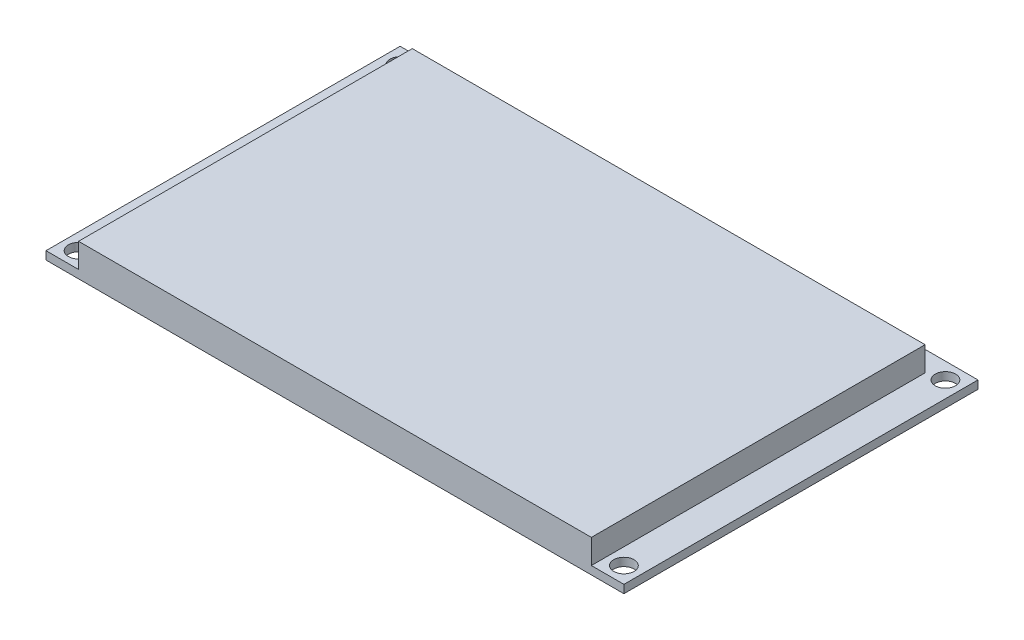
ISO-10303-21;
HEADER;
FILE_DESCRIPTION(('STEP AP214'),'2;1');
FILE_NAME('part.step','',(''),(''),'','','');
FILE_SCHEMA(('AUTOMOTIVE_DESIGN { 1 0 10303 214 1 1 1 1 }'));
ENDSEC;
DATA;
#1=APPLICATION_CONTEXT('core data for automotive mechanical design processes');
#2=APPLICATION_PROTOCOL_DEFINITION('international standard','automotive_design',2000,#1);
#3=PRODUCT_CONTEXT('',#1,'mechanical');
#4=PRODUCT('Part','Part','',(#3));
#5=PRODUCT_RELATED_PRODUCT_CATEGORY('part','',(#4));
#6=PRODUCT_DEFINITION_FORMATION('','',#4);
#7=PRODUCT_DEFINITION_CONTEXT('part definition',#1,'design');
#8=PRODUCT_DEFINITION('design','',#6,#7);
#9=PRODUCT_DEFINITION_SHAPE('','',#8);
#10=(LENGTH_UNIT() NAMED_UNIT(*) SI_UNIT(.MILLI.,.METRE.));
#11=(NAMED_UNIT(*) PLANE_ANGLE_UNIT() SI_UNIT($,.RADIAN.));
#12=(NAMED_UNIT(*) SI_UNIT($,.STERADIAN.) SOLID_ANGLE_UNIT());
#13=UNCERTAINTY_MEASURE_WITH_UNIT(LENGTH_MEASURE(1.E-05),#10,'distance_accuracy_value','');
#14=(GEOMETRIC_REPRESENTATION_CONTEXT(3) GLOBAL_UNCERTAINTY_ASSIGNED_CONTEXT((#13)) GLOBAL_UNIT_ASSIGNED_CONTEXT((#10,
#11,#12)) REPRESENTATION_CONTEXT('',''));
#15=CARTESIAN_POINT('',(0.,0.,0.));
#16=DIRECTION('',(0.,0.,1.));
#17=DIRECTION('',(1.,0.,0.));
#18=AXIS2_PLACEMENT_3D('',#15,#16,#17);
#19=CARTESIAN_POINT('',(35.5,1.,-21.75));
#20=DIRECTION('',(-1.,0.,0.));
#21=DIRECTION('',(0.,0.,1.));
#22=AXIS2_PLACEMENT_3D('',#19,#20,#21);
#23=PLANE('',#22);
#24=DIRECTION('',(0.,0.,-1.));
#25=VECTOR('',#24,1.);
#26=CARTESIAN_POINT('',(35.5,0.,-21.75));
#27=LINE('',#26,#25);
#28=CARTESIAN_POINT('',(35.5,0.,21.75));
#29=VERTEX_POINT('',#28);
#30=CARTESIAN_POINT('',(35.5,0.,-21.75));
#31=VERTEX_POINT('',#30);
#32=EDGE_CURVE('E146',#29,#31,#27,.T.);
#33=ORIENTED_EDGE('',*,*,#32,.T.);
#34=DIRECTION('',(0.,-1.,0.));
#35=VECTOR('',#34,1.);
#36=CARTESIAN_POINT('',(35.5,1.,-21.75));
#37=LINE('',#36,#35);
#38=CARTESIAN_POINT('',(35.5,1.,-21.75));
#39=VERTEX_POINT('',#38);
#40=EDGE_CURVE('E11',#39,#31,#37,.T.);
#41=ORIENTED_EDGE('',*,*,#40,.F.);
#42=DIRECTION('',(0.,0.,-1.));
#43=VECTOR('',#42,1.);
#44=CARTESIAN_POINT('',(35.5,1.,-21.75));
#45=LINE('',#44,#43);
#46=CARTESIAN_POINT('',(35.5,1.,21.75));
#47=VERTEX_POINT('',#46);
#48=EDGE_CURVE('E147',#47,#39,#45,.T.);
#49=ORIENTED_EDGE('',*,*,#48,.F.);
#50=DIRECTION('',(0.,-1.,0.));
#51=VECTOR('',#50,1.);
#52=CARTESIAN_POINT('',(35.5,1.,21.75));
#53=LINE('',#52,#51);
#54=EDGE_CURVE('E158',#47,#29,#53,.T.);
#55=ORIENTED_EDGE('',*,*,#54,.T.);
#56=EDGE_LOOP('',(#33,#41,#49,#55));
#57=FACE_BOUND('',#56,.T.);
#58=ADVANCED_FACE('F33',(#57),#23,.F.);
#59=CARTESIAN_POINT('',(-35.5,1.,-21.75));
#60=DIRECTION('',(0.,0.,1.));
#61=DIRECTION('',(1.,0.,0.));
#62=AXIS2_PLACEMENT_3D('',#59,#60,#61);
#63=PLANE('',#62);
#64=DIRECTION('',(-1.,0.,0.));
#65=VECTOR('',#64,1.);
#66=CARTESIAN_POINT('',(-35.5,0.,-21.75));
#67=LINE('',#66,#65);
#68=CARTESIAN_POINT('',(-35.5,0.,-21.75));
#69=VERTEX_POINT('',#68);
#70=EDGE_CURVE('E161',#31,#69,#67,.T.);
#71=ORIENTED_EDGE('',*,*,#70,.T.);
#72=DIRECTION('',(0.,-1.,0.));
#73=VECTOR('',#72,1.);
#74=CARTESIAN_POINT('',(-35.5,1.,-21.75));
#75=LINE('',#74,#73);
#76=CARTESIAN_POINT('',(-35.5,1.,-21.75));
#77=VERTEX_POINT('',#76);
#78=EDGE_CURVE('E40',#77,#69,#75,.T.);
#79=ORIENTED_EDGE('',*,*,#78,.F.);
#80=DIRECTION('',(-1.,0.,0.));
#81=VECTOR('',#80,1.);
#82=CARTESIAN_POINT('',(-35.5,1.,-21.75));
#83=LINE('',#82,#81);
#84=EDGE_CURVE('E150',#39,#77,#83,.T.);
#85=ORIENTED_EDGE('',*,*,#84,.F.);
#86=ORIENTED_EDGE('',*,*,#40,.T.);
#87=EDGE_LOOP('',(#71,#79,#85,#86));
#88=FACE_BOUND('',#87,.T.);
#89=ADVANCED_FACE('F212',(#88),#63,.F.);
#90=CARTESIAN_POINT('',(-35.5,1.,-21.75));
#91=DIRECTION('',(1.,0.,0.));
#92=DIRECTION('',(0.,0.,-1.));
#93=AXIS2_PLACEMENT_3D('',#90,#91,#92);
#94=PLANE('',#93);
#95=DIRECTION('',(0.,0.,1.));
#96=VECTOR('',#95,1.);
#97=CARTESIAN_POINT('',(-35.5,0.,-21.75));
#98=LINE('',#97,#96);
#99=CARTESIAN_POINT('',(-35.5,0.,21.75));
#100=VERTEX_POINT('',#99);
#101=EDGE_CURVE('E163',#69,#100,#98,.T.);
#102=ORIENTED_EDGE('',*,*,#101,.T.);
#103=DIRECTION('',(0.,-1.,0.));
#104=VECTOR('',#103,1.);
#105=CARTESIAN_POINT('',(-35.5,1.,21.75));
#106=LINE('',#105,#104);
#107=CARTESIAN_POINT('',(-35.5,1.,21.75));
#108=VERTEX_POINT('',#107);
#109=EDGE_CURVE('E168',#108,#100,#106,.T.);
#110=ORIENTED_EDGE('',*,*,#109,.F.);
#111=DIRECTION('',(0.,0.,1.));
#112=VECTOR('',#111,1.);
#113=CARTESIAN_POINT('',(-35.5,1.,-21.75));
#114=LINE('',#113,#112);
#115=EDGE_CURVE('E153',#77,#108,#114,.T.);
#116=ORIENTED_EDGE('',*,*,#115,.F.);
#117=ORIENTED_EDGE('',*,*,#78,.T.);
#118=EDGE_LOOP('',(#102,#110,#116,#117));
#119=FACE_BOUND('',#118,.T.);
#120=ADVANCED_FACE('F175',(#119),#94,.F.);
#121=CARTESIAN_POINT('',(-35.5,1.,21.75));
#122=DIRECTION('',(0.,0.,-1.));
#123=DIRECTION('',(-1.,0.,0.));
#124=AXIS2_PLACEMENT_3D('',#121,#122,#123);
#125=PLANE('',#124);
#126=DIRECTION('',(1.,0.,0.));
#127=VECTOR('',#126,1.);
#128=CARTESIAN_POINT('',(-35.5,0.,21.75));
#129=LINE('',#128,#127);
#130=EDGE_CURVE('E151',#100,#29,#129,.T.);
#131=ORIENTED_EDGE('',*,*,#130,.T.);
#132=ORIENTED_EDGE('',*,*,#54,.F.);
#133=DIRECTION('',(1.,0.,0.));
#134=VECTOR('',#133,1.);
#135=CARTESIAN_POINT('',(-35.5,1.,21.75));
#136=LINE('',#135,#134);
#137=CARTESIAN_POINT('',(31.5,1.,21.75));
#138=VERTEX_POINT('',#137);
#139=EDGE_CURVE('E155',#138,#47,#136,.T.);
#140=ORIENTED_EDGE('',*,*,#139,.F.);
#141=DIRECTION('',(0.,-1.,0.));
#142=VECTOR('',#141,1.);
#143=CARTESIAN_POINT('',(31.5,4.,21.75));
#144=LINE('',#143,#142);
#145=CARTESIAN_POINT('',(31.5,4.,21.75));
#146=VERTEX_POINT('',#145);
#147=EDGE_CURVE('E191',#146,#138,#144,.T.);
#148=ORIENTED_EDGE('',*,*,#147,.F.);
#149=DIRECTION('',(1.,0.,0.));
#150=VECTOR('',#149,1.);
#151=CARTESIAN_POINT('',(-31.5,4.,21.75));
#152=LINE('',#151,#150);
#153=CARTESIAN_POINT('',(-31.5,4.,21.75));
#154=VERTEX_POINT('',#153);
#155=EDGE_CURVE('E110',#154,#146,#152,.T.);
#156=ORIENTED_EDGE('',*,*,#155,.F.);
#157=DIRECTION('',(0.,-1.,0.));
#158=VECTOR('',#157,1.);
#159=CARTESIAN_POINT('',(-31.5,4.,21.75));
#160=LINE('',#159,#158);
#161=CARTESIAN_POINT('',(-31.5,1.,21.75));
#162=VERTEX_POINT('',#161);
#163=EDGE_CURVE('E122',#154,#162,#160,.T.);
#164=ORIENTED_EDGE('',*,*,#163,.T.);
#165=EDGE_CURVE('E156',#108,#162,#136,.T.);
#166=ORIENTED_EDGE('',*,*,#165,.F.);
#167=ORIENTED_EDGE('',*,*,#109,.T.);
#168=EDGE_LOOP('',(#131,#132,#140,#148,#156,#164,#166,#167));
#169=FACE_BOUND('',#168,.T.);
#170=ADVANCED_FACE('F184',(#169),#125,.F.);
#171=CARTESIAN_POINT('',(0.,1.,0.));
#172=DIRECTION('',(0.,1.,0.));
#173=DIRECTION('',(0.,0.,1.));
#174=AXIS2_PLACEMENT_3D('',#171,#172,#173);
#175=PLANE('',#174);
#176=DIRECTION('',(0.,0.,-1.));
#177=VECTOR('',#176,1.);
#178=CARTESIAN_POINT('',(31.5,1.,-19.25));
#179=LINE('',#178,#177);
#180=CARTESIAN_POINT('',(31.5,1.,-19.25));
#181=VERTEX_POINT('',#180);
#182=EDGE_CURVE('E52',#138,#181,#179,.T.);
#183=ORIENTED_EDGE('',*,*,#182,.F.);
#184=ORIENTED_EDGE('',*,*,#139,.T.);
#185=ORIENTED_EDGE('',*,*,#48,.T.);
#186=ORIENTED_EDGE('',*,*,#84,.T.);
#187=ORIENTED_EDGE('',*,*,#115,.T.);
#188=ORIENTED_EDGE('',*,*,#165,.T.);
#189=DIRECTION('',(0.,0.,1.));
#190=VECTOR('',#189,1.);
#191=CARTESIAN_POINT('',(-31.5,1.,-19.25));
#192=LINE('',#191,#190);
#193=CARTESIAN_POINT('',(-31.5,1.,-19.25));
#194=VERTEX_POINT('',#193);
#195=EDGE_CURVE('E114',#194,#162,#192,.T.);
#196=ORIENTED_EDGE('',*,*,#195,.F.);
#197=DIRECTION('',(-1.,0.,0.));
#198=VECTOR('',#197,1.);
#199=CARTESIAN_POINT('',(-31.5,1.,-19.25));
#200=LINE('',#199,#198);
#201=EDGE_CURVE('E47',#181,#194,#200,.T.);
#202=ORIENTED_EDGE('',*,*,#201,.F.);
#203=EDGE_LOOP('',(#183,#184,#185,#186,#187,#188,#196,#202));
#204=FACE_BOUND('',#203,.T.);
#205=CARTESIAN_POINT('',(-33.5,1.,19.75));
#206=DIRECTION('',(0.,1.,0.));
#207=DIRECTION('',(0.,0.,1.));
#208=AXIS2_PLACEMENT_3D('',#205,#206,#207);
#209=CIRCLE('',#208,1.25);
#210=CARTESIAN_POINT('',(-33.5,1.,21.));
#211=VERTEX_POINT('',#210);
#212=EDGE_CURVE('E132',#211,#211,#209,.T.);
#213=ORIENTED_EDGE('',*,*,#212,.F.);
#214=EDGE_LOOP('',(#213));
#215=FACE_BOUND('',#214,.T.);
#216=CARTESIAN_POINT('',(33.5,1.,-19.75));
#217=DIRECTION('',(0.,1.,0.));
#218=DIRECTION('',(0.,0.,1.));
#219=AXIS2_PLACEMENT_3D('',#216,#217,#218);
#220=CIRCLE('',#219,1.25);
#221=CARTESIAN_POINT('',(33.5,1.,-18.5));
#222=VERTEX_POINT('',#221);
#223=EDGE_CURVE('E133',#222,#222,#220,.T.);
#224=ORIENTED_EDGE('',*,*,#223,.F.);
#225=EDGE_LOOP('',(#224));
#226=FACE_BOUND('',#225,.T.);
#227=CARTESIAN_POINT('',(33.5,1.,19.75));
#228=DIRECTION('',(0.,1.,0.));
#229=DIRECTION('',(0.,0.,1.));
#230=AXIS2_PLACEMENT_3D('',#227,#228,#229);
#231=CIRCLE('',#230,1.25);
#232=CARTESIAN_POINT('',(33.5,1.,21.));
#233=VERTEX_POINT('',#232);
#234=EDGE_CURVE('E120',#233,#233,#231,.T.);
#235=ORIENTED_EDGE('',*,*,#234,.F.);
#236=EDGE_LOOP('',(#235));
#237=FACE_BOUND('',#236,.T.);
#238=CARTESIAN_POINT('',(-33.5,1.,-19.75));
#239=DIRECTION('',(0.,1.,0.));
#240=DIRECTION('',(0.,0.,1.));
#241=AXIS2_PLACEMENT_3D('',#238,#239,#240);
#242=CIRCLE('',#241,1.25);
#243=CARTESIAN_POINT('',(-33.5,1.,-18.5));
#244=VERTEX_POINT('',#243);
#245=EDGE_CURVE('E136',#244,#244,#242,.T.);
#246=ORIENTED_EDGE('',*,*,#245,.F.);
#247=EDGE_LOOP('',(#246));
#248=FACE_BOUND('',#247,.T.);
#249=ADVANCED_FACE('F189',(#204,#215,#226,#237,#248),#175,.T.);
#250=CARTESIAN_POINT('',(0.,0.,0.));
#251=DIRECTION('',(0.,1.,0.));
#252=DIRECTION('',(0.,0.,1.));
#253=AXIS2_PLACEMENT_3D('',#250,#251,#252);
#254=PLANE('',#253);
#255=CARTESIAN_POINT('',(-33.5,0.,19.75));
#256=DIRECTION('',(0.,1.,0.));
#257=DIRECTION('',(0.,0.,1.));
#258=AXIS2_PLACEMENT_3D('',#255,#256,#257);
#259=CIRCLE('',#258,1.25);
#260=CARTESIAN_POINT('',(-33.5,0.,21.));
#261=VERTEX_POINT('',#260);
#262=EDGE_CURVE('E129',#261,#261,#259,.F.);
#263=ORIENTED_EDGE('',*,*,#262,.F.);
#264=EDGE_LOOP('',(#263));
#265=FACE_BOUND('',#264,.T.);
#266=CARTESIAN_POINT('',(33.5,0.,-19.75));
#267=DIRECTION('',(0.,1.,0.));
#268=DIRECTION('',(0.,0.,1.));
#269=AXIS2_PLACEMENT_3D('',#266,#267,#268);
#270=CIRCLE('',#269,1.25);
#271=CARTESIAN_POINT('',(33.5,0.,-18.5));
#272=VERTEX_POINT('',#271);
#273=EDGE_CURVE('E128',#272,#272,#270,.F.);
#274=ORIENTED_EDGE('',*,*,#273,.F.);
#275=EDGE_LOOP('',(#274));
#276=FACE_BOUND('',#275,.T.);
#277=CARTESIAN_POINT('',(33.5,0.,19.75));
#278=DIRECTION('',(0.,1.,0.));
#279=DIRECTION('',(0.,0.,1.));
#280=AXIS2_PLACEMENT_3D('',#277,#278,#279);
#281=CIRCLE('',#280,1.25);
#282=CARTESIAN_POINT('',(33.5,0.,21.));
#283=VERTEX_POINT('',#282);
#284=EDGE_CURVE('E117',#283,#283,#281,.F.);
#285=ORIENTED_EDGE('',*,*,#284,.F.);
#286=EDGE_LOOP('',(#285));
#287=FACE_BOUND('',#286,.T.);
#288=CARTESIAN_POINT('',(-33.5,0.,-19.75));
#289=DIRECTION('',(0.,1.,0.));
#290=DIRECTION('',(0.,0.,1.));
#291=AXIS2_PLACEMENT_3D('',#288,#289,#290);
#292=CIRCLE('',#291,1.25);
#293=CARTESIAN_POINT('',(-33.5,0.,-18.5));
#294=VERTEX_POINT('',#293);
#295=EDGE_CURVE('E143',#294,#294,#292,.F.);
#296=ORIENTED_EDGE('',*,*,#295,.F.);
#297=EDGE_LOOP('',(#296));
#298=FACE_BOUND('',#297,.T.);
#299=ORIENTED_EDGE('',*,*,#32,.F.);
#300=ORIENTED_EDGE('',*,*,#130,.F.);
#301=ORIENTED_EDGE('',*,*,#101,.F.);
#302=ORIENTED_EDGE('',*,*,#70,.F.);
#303=EDGE_LOOP('',(#299,#300,#301,#302));
#304=FACE_BOUND('',#303,.T.);
#305=ADVANCED_FACE('F181',(#265,#276,#287,#298,#304),#254,.F.);
#306=CARTESIAN_POINT('',(-33.5,-0.000999999999999916,-19.75));
#307=DIRECTION('',(0.,1.,0.));
#308=DIRECTION('',(0.,0.,1.));
#309=AXIS2_PLACEMENT_3D('',#306,#307,#308);
#310=CYLINDRICAL_SURFACE('',#309,1.25);
#311=ORIENTED_EDGE('',*,*,#245,.T.);
#312=EDGE_LOOP('',(#311));
#313=FACE_BOUND('',#312,.T.);
#314=ORIENTED_EDGE('',*,*,#295,.T.);
#315=EDGE_LOOP('',(#314));
#316=FACE_BOUND('',#315,.T.);
#317=ADVANCED_FACE('F225',(#313,#316),#310,.F.);
#318=CARTESIAN_POINT('',(33.5,-0.000999999999999916,19.75));
#319=DIRECTION('',(0.,1.,0.));
#320=DIRECTION('',(0.,0.,1.));
#321=AXIS2_PLACEMENT_3D('',#318,#319,#320);
#322=CYLINDRICAL_SURFACE('',#321,1.25);
#323=ORIENTED_EDGE('',*,*,#234,.T.);
#324=EDGE_LOOP('',(#323));
#325=FACE_BOUND('',#324,.T.);
#326=ORIENTED_EDGE('',*,*,#284,.T.);
#327=EDGE_LOOP('',(#326));
#328=FACE_BOUND('',#327,.T.);
#329=ADVANCED_FACE('F231',(#325,#328),#322,.F.);
#330=CARTESIAN_POINT('',(33.5,-0.000999999999999916,-19.75));
#331=DIRECTION('',(0.,1.,0.));
#332=DIRECTION('',(0.,0.,1.));
#333=AXIS2_PLACEMENT_3D('',#330,#331,#332);
#334=CYLINDRICAL_SURFACE('',#333,1.25);
#335=ORIENTED_EDGE('',*,*,#223,.T.);
#336=EDGE_LOOP('',(#335));
#337=FACE_BOUND('',#336,.T.);
#338=ORIENTED_EDGE('',*,*,#273,.T.);
#339=EDGE_LOOP('',(#338));
#340=FACE_BOUND('',#339,.T.);
#341=ADVANCED_FACE('F233',(#337,#340),#334,.F.);
#342=CARTESIAN_POINT('',(-33.5,-0.000999999999999916,19.75));
#343=DIRECTION('',(0.,1.,0.));
#344=DIRECTION('',(0.,0.,1.));
#345=AXIS2_PLACEMENT_3D('',#342,#343,#344);
#346=CYLINDRICAL_SURFACE('',#345,1.25);
#347=ORIENTED_EDGE('',*,*,#212,.T.);
#348=EDGE_LOOP('',(#347));
#349=FACE_BOUND('',#348,.T.);
#350=ORIENTED_EDGE('',*,*,#262,.T.);
#351=EDGE_LOOP('',(#350));
#352=FACE_BOUND('',#351,.T.);
#353=ADVANCED_FACE('F236',(#349,#352),#346,.F.);
#354=CARTESIAN_POINT('',(31.5,4.,-19.25));
#355=DIRECTION('',(-1.,0.,0.));
#356=DIRECTION('',(0.,0.,1.));
#357=AXIS2_PLACEMENT_3D('',#354,#355,#356);
#358=PLANE('',#357);
#359=ORIENTED_EDGE('',*,*,#182,.T.);
#360=DIRECTION('',(0.,-1.,0.));
#361=VECTOR('',#360,1.);
#362=CARTESIAN_POINT('',(31.5,4.,-19.25));
#363=LINE('',#362,#361);
#364=CARTESIAN_POINT('',(31.5,4.,-19.25));
#365=VERTEX_POINT('',#364);
#366=EDGE_CURVE('E99',#365,#181,#363,.T.);
#367=ORIENTED_EDGE('',*,*,#366,.F.);
#368=DIRECTION('',(0.,0.,-1.));
#369=VECTOR('',#368,1.);
#370=CARTESIAN_POINT('',(31.5,4.,-19.25));
#371=LINE('',#370,#369);
#372=EDGE_CURVE('E105',#146,#365,#371,.T.);
#373=ORIENTED_EDGE('',*,*,#372,.F.);
#374=ORIENTED_EDGE('',*,*,#147,.T.);
#375=EDGE_LOOP('',(#359,#367,#373,#374));
#376=FACE_BOUND('',#375,.T.);
#377=ADVANCED_FACE('F116',(#376),#358,.F.);
#378=CARTESIAN_POINT('',(-31.5,4.,-19.25));
#379=DIRECTION('',(0.,0.,1.));
#380=DIRECTION('',(1.,0.,0.));
#381=AXIS2_PLACEMENT_3D('',#378,#379,#380);
#382=PLANE('',#381);
#383=ORIENTED_EDGE('',*,*,#201,.T.);
#384=DIRECTION('',(0.,-1.,0.));
#385=VECTOR('',#384,1.);
#386=CARTESIAN_POINT('',(-31.5,4.,-19.25));
#387=LINE('',#386,#385);
#388=CARTESIAN_POINT('',(-31.5,4.,-19.25));
#389=VERTEX_POINT('',#388);
#390=EDGE_CURVE('E101',#389,#194,#387,.T.);
#391=ORIENTED_EDGE('',*,*,#390,.F.);
#392=DIRECTION('',(-1.,0.,0.));
#393=VECTOR('',#392,1.);
#394=CARTESIAN_POINT('',(-31.5,4.,-19.25));
#395=LINE('',#394,#393);
#396=EDGE_CURVE('E95',#365,#389,#395,.T.);
#397=ORIENTED_EDGE('',*,*,#396,.F.);
#398=ORIENTED_EDGE('',*,*,#366,.T.);
#399=EDGE_LOOP('',(#383,#391,#397,#398));
#400=FACE_BOUND('',#399,.T.);
#401=ADVANCED_FACE('F97',(#400),#382,.F.);
#402=CARTESIAN_POINT('',(-31.5,4.,-19.25));
#403=DIRECTION('',(1.,0.,0.));
#404=DIRECTION('',(0.,0.,-1.));
#405=AXIS2_PLACEMENT_3D('',#402,#403,#404);
#406=PLANE('',#405);
#407=ORIENTED_EDGE('',*,*,#195,.T.);
#408=ORIENTED_EDGE('',*,*,#163,.F.);
#409=DIRECTION('',(0.,0.,1.));
#410=VECTOR('',#409,1.);
#411=CARTESIAN_POINT('',(-31.5,4.,-19.25));
#412=LINE('',#411,#410);
#413=EDGE_CURVE('E104',#389,#154,#412,.T.);
#414=ORIENTED_EDGE('',*,*,#413,.F.);
#415=ORIENTED_EDGE('',*,*,#390,.T.);
#416=EDGE_LOOP('',(#407,#408,#414,#415));
#417=FACE_BOUND('',#416,.T.);
#418=ADVANCED_FACE('F202',(#417),#406,.F.);
#419=CARTESIAN_POINT('',(0.,4.,0.));
#420=DIRECTION('',(0.,1.,0.));
#421=DIRECTION('',(0.,0.,1.));
#422=AXIS2_PLACEMENT_3D('',#419,#420,#421);
#423=PLANE('',#422);
#424=ORIENTED_EDGE('',*,*,#372,.T.);
#425=ORIENTED_EDGE('',*,*,#396,.T.);
#426=ORIENTED_EDGE('',*,*,#413,.T.);
#427=ORIENTED_EDGE('',*,*,#155,.T.);
#428=EDGE_LOOP('',(#424,#425,#426,#427));
#429=FACE_BOUND('',#428,.T.);
#430=ADVANCED_FACE('F108',(#429),#423,.T.);
#431=CLOSED_SHELL('',(#58,#89,#120,#170,#249,#305,#317,#329,#341,#353,#377,#401,#418,#430));
#432=MANIFOLD_SOLID_BREP('B2',#431);
#433=ADVANCED_BREP_SHAPE_REPRESENTATION('',(#18,#432),#14);
#434=SHAPE_DEFINITION_REPRESENTATION(#9,#433);
ENDSEC;
END-ISO-10303-21;
